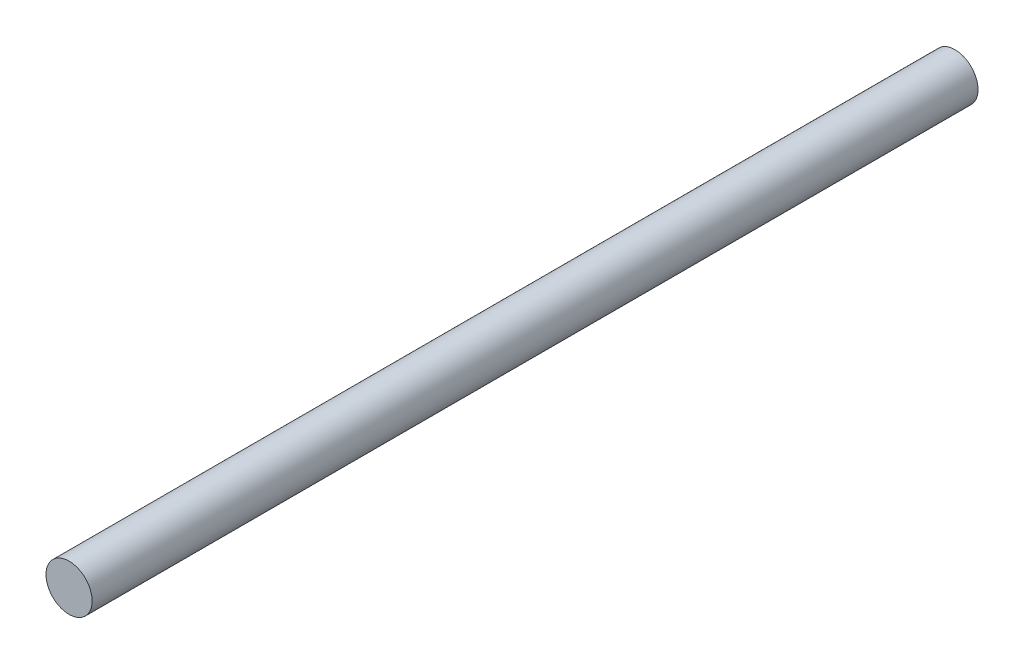
ISO-10303-21;
HEADER;
FILE_DESCRIPTION(('STEP AP214'),'2;1');
FILE_NAME('part.step','',(''),(''),'','','');
FILE_SCHEMA(('AUTOMOTIVE_DESIGN { 1 0 10303 214 1 1 1 1 }'));
ENDSEC;
DATA;
#1=APPLICATION_CONTEXT('core data for automotive mechanical design processes');
#2=APPLICATION_PROTOCOL_DEFINITION('international standard','automotive_design',2000,#1);
#3=PRODUCT_CONTEXT('',#1,'mechanical');
#4=PRODUCT('Part','Part','',(#3));
#5=PRODUCT_RELATED_PRODUCT_CATEGORY('part','',(#4));
#6=PRODUCT_DEFINITION_FORMATION('','',#4);
#7=PRODUCT_DEFINITION_CONTEXT('part definition',#1,'design');
#8=PRODUCT_DEFINITION('design','',#6,#7);
#9=PRODUCT_DEFINITION_SHAPE('','',#8);
#10=(LENGTH_UNIT() NAMED_UNIT(*) SI_UNIT(.MILLI.,.METRE.));
#11=(NAMED_UNIT(*) PLANE_ANGLE_UNIT() SI_UNIT($,.RADIAN.));
#12=(NAMED_UNIT(*) SI_UNIT($,.STERADIAN.) SOLID_ANGLE_UNIT());
#13=UNCERTAINTY_MEASURE_WITH_UNIT(LENGTH_MEASURE(1.E-05),#10,'distance_accuracy_value','');
#14=(GEOMETRIC_REPRESENTATION_CONTEXT(3) GLOBAL_UNCERTAINTY_ASSIGNED_CONTEXT((#13)) GLOBAL_UNIT_ASSIGNED_CONTEXT((#10,
#11,#12)) REPRESENTATION_CONTEXT('',''));
#15=CARTESIAN_POINT('',(0.,0.,0.));
#16=DIRECTION('',(0.,0.,1.));
#17=DIRECTION('',(1.,0.,0.));
#18=AXIS2_PLACEMENT_3D('',#15,#16,#17);
#19=CARTESIAN_POINT('',(0.,0.,76.2));
#20=DIRECTION('',(0.,0.,-1.));
#21=DIRECTION('',(-1.,0.,0.));
#22=AXIS2_PLACEMENT_3D('',#19,#20,#21);
#23=CYLINDRICAL_SURFACE('',#22,3.96875);
#24=CARTESIAN_POINT('',(0.,0.,76.2));
#25=DIRECTION('',(0.,0.,1.));
#26=DIRECTION('',(1.,0.,0.));
#27=AXIS2_PLACEMENT_3D('',#24,#25,#26);
#28=CIRCLE('',#27,3.96875);
#29=CARTESIAN_POINT('',(-3.96875,0.,76.2));
#30=VERTEX_POINT('',#29);
#31=EDGE_CURVE('E10',#30,#30,#28,.T.);
#32=CARTESIAN_POINT('',(0.,0.,-76.2));
#33=DIRECTION('',(0.,0.,1.));
#34=DIRECTION('',(1.,0.,0.));
#35=AXIS2_PLACEMENT_3D('',#32,#33,#34);
#36=CIRCLE('',#35,3.96875);
#37=CARTESIAN_POINT('',(-3.96875,0.,-76.2));
#38=VERTEX_POINT('',#37);
#39=EDGE_CURVE('E35',#38,#38,#36,.T.);
#40=CARTESIAN_POINT('',(-3.96875,0.,76.2));
#41=CARTESIAN_POINT('',(-3.96875,0.,74.6125));
#42=CARTESIAN_POINT('',(-3.96875,0.,73.025));
#43=CARTESIAN_POINT('',(-3.96875,0.,69.85));
#44=CARTESIAN_POINT('',(-3.96875,0.,68.2625));
#45=CARTESIAN_POINT('',(-3.96875,0.,65.0875));
#46=CARTESIAN_POINT('',(-3.96875,0.,63.5));
#47=CARTESIAN_POINT('',(-3.96875,0.,60.325));
#48=CARTESIAN_POINT('',(-3.96875,0.,58.7375));
#49=CARTESIAN_POINT('',(-3.96875,0.,55.5625));
#50=CARTESIAN_POINT('',(-3.96875,0.,53.975));
#51=CARTESIAN_POINT('',(-3.96875,0.,50.8));
#52=CARTESIAN_POINT('',(-3.96875,0.,49.2125));
#53=CARTESIAN_POINT('',(-3.96875,0.,46.0375));
#54=CARTESIAN_POINT('',(-3.96875,0.,44.45));
#55=CARTESIAN_POINT('',(-3.96875,0.,41.275));
#56=CARTESIAN_POINT('',(-3.96875,0.,39.6875));
#57=CARTESIAN_POINT('',(-3.96875,0.,36.5125));
#58=CARTESIAN_POINT('',(-3.96875,0.,34.925));
#59=CARTESIAN_POINT('',(-3.96875,0.,31.75));
#60=CARTESIAN_POINT('',(-3.96875,0.,30.1625));
#61=CARTESIAN_POINT('',(-3.96875,0.,26.9875));
#62=CARTESIAN_POINT('',(-3.96875,0.,25.4));
#63=CARTESIAN_POINT('',(-3.96875,0.,22.225));
#64=CARTESIAN_POINT('',(-3.96875,0.,20.6375));
#65=CARTESIAN_POINT('',(-3.96875,0.,17.4625));
#66=CARTESIAN_POINT('',(-3.96875,0.,15.875));
#67=CARTESIAN_POINT('',(-3.96875,0.,12.7));
#68=CARTESIAN_POINT('',(-3.96875,0.,11.1125));
#69=CARTESIAN_POINT('',(-3.96875,0.,7.93750000000001));
#70=CARTESIAN_POINT('',(-3.96875,0.,6.35));
#71=CARTESIAN_POINT('',(-3.96875,0.,3.175));
#72=CARTESIAN_POINT('',(-3.96875,0.,1.5875));
#73=CARTESIAN_POINT('',(-3.96875,0.,-1.5875));
#74=CARTESIAN_POINT('',(-3.96875,0.,-3.175));
#75=CARTESIAN_POINT('',(-3.96875,0.,-6.35));
#76=CARTESIAN_POINT('',(-3.96875,0.,-7.93750000000001));
#77=CARTESIAN_POINT('',(-3.96875,0.,-11.1125));
#78=CARTESIAN_POINT('',(-3.96875,0.,-12.7));
#79=CARTESIAN_POINT('',(-3.96875,0.,-15.875));
#80=CARTESIAN_POINT('',(-3.96875,0.,-17.4625));
#81=CARTESIAN_POINT('',(-3.96875,0.,-20.6375));
#82=CARTESIAN_POINT('',(-3.96875,0.,-22.225));
#83=CARTESIAN_POINT('',(-3.96875,0.,-25.4));
#84=CARTESIAN_POINT('',(-3.96875,0.,-26.9875));
#85=CARTESIAN_POINT('',(-3.96875,0.,-30.1625));
#86=CARTESIAN_POINT('',(-3.96875,0.,-31.75));
#87=CARTESIAN_POINT('',(-3.96875,0.,-34.925));
#88=CARTESIAN_POINT('',(-3.96875,0.,-36.5125));
#89=CARTESIAN_POINT('',(-3.96875,0.,-39.6875));
#90=CARTESIAN_POINT('',(-3.96875,0.,-41.275));
#91=CARTESIAN_POINT('',(-3.96875,0.,-44.45));
#92=CARTESIAN_POINT('',(-3.96875,0.,-46.0375));
#93=CARTESIAN_POINT('',(-3.96875,0.,-49.2125));
#94=CARTESIAN_POINT('',(-3.96875,0.,-50.8));
#95=CARTESIAN_POINT('',(-3.96875,0.,-53.975));
#96=CARTESIAN_POINT('',(-3.96875,0.,-55.5625));
#97=CARTESIAN_POINT('',(-3.96875,0.,-58.7375));
#98=CARTESIAN_POINT('',(-3.96875,0.,-60.325));
#99=CARTESIAN_POINT('',(-3.96875,0.,-63.5));
#100=CARTESIAN_POINT('',(-3.96875,0.,-65.0875));
#101=CARTESIAN_POINT('',(-3.96875,0.,-68.2625));
#102=CARTESIAN_POINT('',(-3.96875,0.,-69.85));
#103=CARTESIAN_POINT('',(-3.96875,0.,-73.025));
#104=CARTESIAN_POINT('',(-3.96875,0.,-74.6125));
#105=CARTESIAN_POINT('',(-3.96875,0.,-76.2));
#106=B_SPLINE_CURVE_WITH_KNOTS('',3,(#40,#41,#42,#43,#44,#45,#46,#47,#48,#49,#50,#51,#52,#53,
#54,#55,#56,#57,#58,#59,#60,#61,#62,#63,#64,#65,#66,#67,#68,#69,#70,#71,#72,#73,#74,#75,#76,#77,
#78,#79,#80,#81,#82,#83,#84,#85,#86,#87,#88,#89,#90,#91,#92,#93,#94,#95,#96,#97,#98,#99,#100,
#101,#102,#103,#104,#105),.UNSPECIFIED.,.F.,.F.,(4,2,2,2,2,2,2,2,2,2,2,2,2,2,2,2,2,2,2,2,2,2,2,
2,2,2,2,2,2,2,2,2,4),(0.,4.7625,9.52500000000001,14.2875,19.05,23.8125,28.575,33.3375,38.1,
42.8625,47.625,52.3875,57.15,61.9125,66.675,71.4375,76.2,80.9625,85.725,90.4875,95.25,100.0125,
104.775,109.5375,114.3,119.0625,123.825,128.5875,133.35,138.1125,142.875,147.6375,152.4),.UNSPECIFIED.);
#107=EDGE_CURVE('BSEAM32',#30,#38,#106,.T.);
#108=ORIENTED_EDGE('',*,*,#31,.F.);
#109=ORIENTED_EDGE('',*,*,#39,.T.);
#110=ORIENTED_EDGE('',*,*,#107,.T.);
#111=ORIENTED_EDGE('',*,*,#107,.F.);
#112=EDGE_LOOP('',(#108,#110,#109,#111));
#113=FACE_BOUND('',#112,.T.);
#114=ADVANCED_FACE('F32',(#113),#23,.T.);
#115=CARTESIAN_POINT('',(0.,0.,76.2));
#116=DIRECTION('',(0.,0.,1.));
#117=DIRECTION('',(1.,0.,0.));
#118=AXIS2_PLACEMENT_3D('',#115,#116,#117);
#119=PLANE('',#118);
#120=ORIENTED_EDGE('',*,*,#31,.T.);
#121=EDGE_LOOP('',(#120));
#122=FACE_BOUND('',#121,.T.);
#123=ADVANCED_FACE('F47',(#122),#119,.T.);
#124=CARTESIAN_POINT('',(0.,0.,-76.2));
#125=DIRECTION('',(0.,0.,1.));
#126=DIRECTION('',(1.,0.,0.));
#127=AXIS2_PLACEMENT_3D('',#124,#125,#126);
#128=PLANE('',#127);
#129=ORIENTED_EDGE('',*,*,#39,.F.);
#130=EDGE_LOOP('',(#129));
#131=FACE_BOUND('',#130,.T.);
#132=ADVANCED_FACE('F45',(#131),#128,.F.);
#133=CLOSED_SHELL('',(#114,#123,#132));
#134=MANIFOLD_SOLID_BREP('B2',#133);
#135=ADVANCED_BREP_SHAPE_REPRESENTATION('',(#18,#134),#14);
#136=SHAPE_DEFINITION_REPRESENTATION(#9,#135);
ENDSEC;
END-ISO-10303-21;
